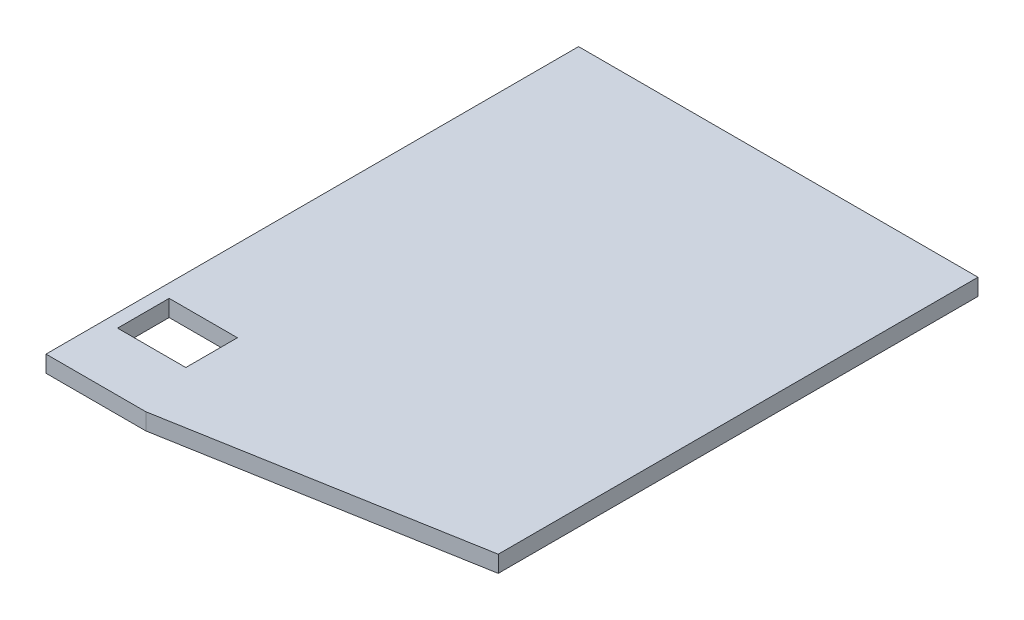
ISO-10303-21;
HEADER;
FILE_DESCRIPTION(('STEP AP214'),'2;1');
FILE_NAME('part.step','',(''),(''),'','','');
FILE_SCHEMA(('AUTOMOTIVE_DESIGN { 1 0 10303 214 1 1 1 1 }'));
ENDSEC;
DATA;
#1=APPLICATION_CONTEXT('core data for automotive mechanical design processes');
#2=APPLICATION_PROTOCOL_DEFINITION('international standard','automotive_design',2000,#1);
#3=PRODUCT_CONTEXT('',#1,'mechanical');
#4=PRODUCT('Part','Part','',(#3));
#5=PRODUCT_RELATED_PRODUCT_CATEGORY('part','',(#4));
#6=PRODUCT_DEFINITION_FORMATION('','',#4);
#7=PRODUCT_DEFINITION_CONTEXT('part definition',#1,'design');
#8=PRODUCT_DEFINITION('design','',#6,#7);
#9=PRODUCT_DEFINITION_SHAPE('','',#8);
#10=(LENGTH_UNIT() NAMED_UNIT(*) SI_UNIT(.MILLI.,.METRE.));
#11=(NAMED_UNIT(*) PLANE_ANGLE_UNIT() SI_UNIT($,.RADIAN.));
#12=(NAMED_UNIT(*) SI_UNIT($,.STERADIAN.) SOLID_ANGLE_UNIT());
#13=UNCERTAINTY_MEASURE_WITH_UNIT(LENGTH_MEASURE(1.E-05),#10,'distance_accuracy_value','');
#14=(GEOMETRIC_REPRESENTATION_CONTEXT(3) GLOBAL_UNCERTAINTY_ASSIGNED_CONTEXT((#13)) GLOBAL_UNIT_ASSIGNED_CONTEXT((#10,
#11,#12)) REPRESENTATION_CONTEXT('',''));
#15=CARTESIAN_POINT('',(0.,0.,0.));
#16=DIRECTION('',(0.,0.,1.));
#17=DIRECTION('',(1.,0.,0.));
#18=AXIS2_PLACEMENT_3D('',#15,#16,#17);
#19=CARTESIAN_POINT('',(0.,0.,33.));
#20=DIRECTION('',(0.,1.,0.));
#21=DIRECTION('',(-1.,0.,0.));
#22=AXIS2_PLACEMENT_3D('',#19,#20,#21);
#23=PLANE('',#22);
#24=DIRECTION('',(1.,0.,0.));
#25=VECTOR('',#24,1.);
#26=CARTESIAN_POINT('',(24.,0.,32.));
#27=LINE('',#26,#25);
#28=CARTESIAN_POINT('',(0.,0.,32.));
#29=VERTEX_POINT('',#28);
#30=CARTESIAN_POINT('',(6.,0.,32.));
#31=VERTEX_POINT('',#30);
#32=EDGE_CURVE('E157',#29,#31,#27,.T.);
#33=ORIENTED_EDGE('',*,*,#32,.F.);
#34=DIRECTION('',(0.,0.,-1.));
#35=VECTOR('',#34,1.);
#36=CARTESIAN_POINT('',(0.,0.,33.));
#37=LINE('',#36,#35);
#38=CARTESIAN_POINT('',(0.,0.,0.));
#39=VERTEX_POINT('',#38);
#40=EDGE_CURVE('E50',#29,#39,#37,.T.);
#41=ORIENTED_EDGE('',*,*,#40,.T.);
#42=DIRECTION('',(1.,0.,0.));
#43=VECTOR('',#42,1.);
#44=CARTESIAN_POINT('',(0.,0.,0.));
#45=LINE('',#44,#43);
#46=CARTESIAN_POINT('',(24.,0.,0.));
#47=VERTEX_POINT('',#46);
#48=EDGE_CURVE('E140',#39,#47,#45,.T.);
#49=ORIENTED_EDGE('',*,*,#48,.T.);
#50=DIRECTION('',(0.,0.,-1.));
#51=VECTOR('',#50,1.);
#52=CARTESIAN_POINT('',(24.,0.,33.));
#53=LINE('',#52,#51);
#54=CARTESIAN_POINT('',(24.,0.,28.8261143472476));
#55=VERTEX_POINT('',#54);
#56=EDGE_CURVE('E11',#55,#47,#53,.T.);
#57=ORIENTED_EDGE('',*,*,#56,.F.);
#58=DIRECTION('',(0.984807753012208,0.,-0.173648177666931));
#59=VECTOR('',#58,1.);
#60=CARTESIAN_POINT('',(6.,0.,32.));
#61=LINE('',#60,#59);
#62=EDGE_CURVE('E173',#31,#55,#61,.T.);
#63=ORIENTED_EDGE('',*,*,#62,.F.);
#64=EDGE_LOOP('',(#33,#41,#49,#57,#63));
#65=FACE_BOUND('',#64,.T.);
#66=DIRECTION('',(0.,0.,1.));
#67=VECTOR('',#66,1.);
#68=CARTESIAN_POINT('',(0.800000000000001,0.,28.5));
#69=LINE('',#68,#67);
#70=CARTESIAN_POINT('',(0.800000000000001,0.,25.4));
#71=VERTEX_POINT('',#70);
#72=CARTESIAN_POINT('',(0.800000000000002,0.,28.5));
#73=VERTEX_POINT('',#72);
#74=EDGE_CURVE('E176',#71,#73,#69,.T.);
#75=ORIENTED_EDGE('',*,*,#74,.T.);
#76=DIRECTION('',(-1.,0.,0.));
#77=VECTOR('',#76,1.);
#78=CARTESIAN_POINT('',(4.9,0.,28.5));
#79=LINE('',#78,#77);
#80=CARTESIAN_POINT('',(4.9,0.,28.5));
#81=VERTEX_POINT('',#80);
#82=EDGE_CURVE('E134',#81,#73,#79,.T.);
#83=ORIENTED_EDGE('',*,*,#82,.F.);
#84=DIRECTION('',(0.,0.,1.));
#85=VECTOR('',#84,1.);
#86=CARTESIAN_POINT('',(4.9,0.,28.5));
#87=LINE('',#86,#85);
#88=CARTESIAN_POINT('',(4.9,0.,25.4));
#89=VERTEX_POINT('',#88);
#90=EDGE_CURVE('E130',#89,#81,#87,.T.);
#91=ORIENTED_EDGE('',*,*,#90,.F.);
#92=DIRECTION('',(-1.,0.,0.));
#93=VECTOR('',#92,1.);
#94=CARTESIAN_POINT('',(4.9,0.,25.4));
#95=LINE('',#94,#93);
#96=EDGE_CURVE('E131',#89,#71,#95,.T.);
#97=ORIENTED_EDGE('',*,*,#96,.T.);
#98=EDGE_LOOP('',(#75,#83,#91,#97));
#99=FACE_BOUND('',#98,.T.);
#100=ADVANCED_FACE('F43',(#65,#99),#23,.F.);
#101=CARTESIAN_POINT('',(24.,0.,33.));
#102=DIRECTION('',(-1.,0.,0.));
#103=DIRECTION('',(0.,0.,1.));
#104=AXIS2_PLACEMENT_3D('',#101,#102,#103);
#105=PLANE('',#104);
#106=DIRECTION('',(0.,1.,0.));
#107=VECTOR('',#106,1.);
#108=CARTESIAN_POINT('',(24.,0.,0.));
#109=LINE('',#108,#107);
#110=CARTESIAN_POINT('',(24.,1.,0.));
#111=VERTEX_POINT('',#110);
#112=EDGE_CURVE('E144',#47,#111,#109,.T.);
#113=ORIENTED_EDGE('',*,*,#112,.T.);
#114=DIRECTION('',(0.,0.,1.));
#115=VECTOR('',#114,1.);
#116=CARTESIAN_POINT('',(24.,1.,0.));
#117=LINE('',#116,#115);
#118=CARTESIAN_POINT('',(24.,1.,28.8261143472476));
#119=VERTEX_POINT('',#118);
#120=EDGE_CURVE('E169',#111,#119,#117,.T.);
#121=ORIENTED_EDGE('',*,*,#120,.T.);
#122=DIRECTION('',(0.,-1.,0.));
#123=VECTOR('',#122,1.);
#124=CARTESIAN_POINT('',(24.,2.50000000000001,28.8261143472476));
#125=LINE('',#124,#123);
#126=EDGE_CURVE('E171',#119,#55,#125,.T.);
#127=ORIENTED_EDGE('',*,*,#126,.T.);
#128=ORIENTED_EDGE('',*,*,#56,.T.);
#129=EDGE_LOOP('',(#113,#121,#127,#128));
#130=FACE_BOUND('',#129,.T.);
#131=ADVANCED_FACE('F168',(#130),#105,.F.);
#132=CARTESIAN_POINT('',(0.,0.,33.));
#133=DIRECTION('',(1.,0.,0.));
#134=DIRECTION('',(0.,0.,-1.));
#135=AXIS2_PLACEMENT_3D('',#132,#133,#134);
#136=PLANE('',#135);
#137=DIRECTION('',(0.,-1.,0.));
#138=VECTOR('',#137,1.);
#139=CARTESIAN_POINT('',(0.,0.,32.));
#140=LINE('',#139,#138);
#141=CARTESIAN_POINT('',(0.,1.,32.));
#142=VERTEX_POINT('',#141);
#143=EDGE_CURVE('E181',#142,#29,#140,.T.);
#144=ORIENTED_EDGE('',*,*,#143,.F.);
#145=DIRECTION('',(0.,0.,-1.));
#146=VECTOR('',#145,1.);
#147=CARTESIAN_POINT('',(0.,1.,32.));
#148=LINE('',#147,#146);
#149=CARTESIAN_POINT('',(0.,1.,0.));
#150=VERTEX_POINT('',#149);
#151=EDGE_CURVE('E195',#142,#150,#148,.T.);
#152=ORIENTED_EDGE('',*,*,#151,.T.);
#153=DIRECTION('',(0.,-1.,0.));
#154=VECTOR('',#153,1.);
#155=CARTESIAN_POINT('',(0.,0.,0.));
#156=LINE('',#155,#154);
#157=EDGE_CURVE('E147',#150,#39,#156,.T.);
#158=ORIENTED_EDGE('',*,*,#157,.T.);
#159=ORIENTED_EDGE('',*,*,#40,.F.);
#160=EDGE_LOOP('',(#144,#152,#158,#159));
#161=FACE_BOUND('',#160,.T.);
#162=ADVANCED_FACE('F212',(#161),#136,.F.);
#163=CARTESIAN_POINT('',(0.,0.,0.));
#164=DIRECTION('',(0.,0.,1.));
#165=DIRECTION('',(1.,0.,0.));
#166=AXIS2_PLACEMENT_3D('',#163,#164,#165);
#167=PLANE('',#166);
#168=ORIENTED_EDGE('',*,*,#157,.F.);
#169=DIRECTION('',(1.,0.,0.));
#170=VECTOR('',#169,1.);
#171=CARTESIAN_POINT('',(0.,1.,0.));
#172=LINE('',#171,#170);
#173=EDGE_CURVE('E165',#150,#111,#172,.T.);
#174=ORIENTED_EDGE('',*,*,#173,.T.);
#175=ORIENTED_EDGE('',*,*,#112,.F.);
#176=ORIENTED_EDGE('',*,*,#48,.F.);
#177=EDGE_LOOP('',(#168,#174,#175,#176));
#178=FACE_BOUND('',#177,.T.);
#179=ADVANCED_FACE('F163',(#178),#167,.F.);
#180=CARTESIAN_POINT('',(4.9,2.5,28.5));
#181=DIRECTION('',(0.,0.,1.));
#182=DIRECTION('',(1.,0.,0.));
#183=AXIS2_PLACEMENT_3D('',#180,#181,#182);
#184=PLANE('',#183);
#185=DIRECTION('',(0.,1.,0.));
#186=VECTOR('',#185,1.);
#187=CARTESIAN_POINT('',(0.800000000000002,-3.20156211871642,28.5));
#188=LINE('',#187,#186);
#189=CARTESIAN_POINT('',(0.800000000000001,1.,28.5));
#190=VERTEX_POINT('',#189);
#191=EDGE_CURVE('E125',#73,#190,#188,.T.);
#192=ORIENTED_EDGE('',*,*,#191,.T.);
#193=DIRECTION('',(-1.,0.,0.));
#194=VECTOR('',#193,1.);
#195=CARTESIAN_POINT('',(4.9,1.,28.5));
#196=LINE('',#195,#194);
#197=CARTESIAN_POINT('',(4.9,1.,28.5));
#198=VERTEX_POINT('',#197);
#199=EDGE_CURVE('E65',#198,#190,#196,.T.);
#200=ORIENTED_EDGE('',*,*,#199,.F.);
#201=DIRECTION('',(0.,1.,0.));
#202=VECTOR('',#201,1.);
#203=CARTESIAN_POINT('',(4.9,2.5,28.5));
#204=LINE('',#203,#202);
#205=EDGE_CURVE('E122',#81,#198,#204,.T.);
#206=ORIENTED_EDGE('',*,*,#205,.F.);
#207=ORIENTED_EDGE('',*,*,#82,.T.);
#208=EDGE_LOOP('',(#192,#200,#206,#207));
#209=FACE_BOUND('',#208,.T.);
#210=ADVANCED_FACE('F121',(#209),#184,.F.);
#211=CARTESIAN_POINT('',(4.9,2.5,25.4));
#212=DIRECTION('',(0.,0.,-1.));
#213=DIRECTION('',(-1.,0.,0.));
#214=AXIS2_PLACEMENT_3D('',#211,#212,#213);
#215=PLANE('',#214);
#216=DIRECTION('',(0.,-1.,0.));
#217=VECTOR('',#216,1.);
#218=CARTESIAN_POINT('',(4.9,2.5,25.4));
#219=LINE('',#218,#217);
#220=CARTESIAN_POINT('',(4.9,1.,25.4));
#221=VERTEX_POINT('',#220);
#222=EDGE_CURVE('E136',#221,#89,#219,.T.);
#223=ORIENTED_EDGE('',*,*,#222,.F.);
#224=DIRECTION('',(1.,0.,0.));
#225=VECTOR('',#224,1.);
#226=CARTESIAN_POINT('',(0.800000000000001,1.,25.4));
#227=LINE('',#226,#225);
#228=CARTESIAN_POINT('',(0.800000000000001,1.,25.4));
#229=VERTEX_POINT('',#228);
#230=EDGE_CURVE('E113',#229,#221,#227,.T.);
#231=ORIENTED_EDGE('',*,*,#230,.F.);
#232=DIRECTION('',(0.,1.,0.));
#233=VECTOR('',#232,1.);
#234=CARTESIAN_POINT('',(0.800000000000002,-3.20156211871642,25.4));
#235=LINE('',#234,#233);
#236=EDGE_CURVE('E188',#71,#229,#235,.T.);
#237=ORIENTED_EDGE('',*,*,#236,.F.);
#238=ORIENTED_EDGE('',*,*,#96,.F.);
#239=EDGE_LOOP('',(#223,#231,#237,#238));
#240=FACE_BOUND('',#239,.T.);
#241=ADVANCED_FACE('F205',(#240),#215,.F.);
#242=CARTESIAN_POINT('',(4.9,0.,0.));
#243=DIRECTION('',(-1.,0.,0.));
#244=DIRECTION('',(0.,0.,1.));
#245=AXIS2_PLACEMENT_3D('',#242,#243,#244);
#246=PLANE('',#245);
#247=DIRECTION('',(0.,0.,1.));
#248=VECTOR('',#247,1.);
#249=CARTESIAN_POINT('',(4.9,1.,25.4));
#250=LINE('',#249,#248);
#251=EDGE_CURVE('E110',#221,#198,#250,.T.);
#252=ORIENTED_EDGE('',*,*,#251,.F.);
#253=ORIENTED_EDGE('',*,*,#222,.T.);
#254=ORIENTED_EDGE('',*,*,#90,.T.);
#255=ORIENTED_EDGE('',*,*,#205,.T.);
#256=EDGE_LOOP('',(#252,#253,#254,#255));
#257=FACE_BOUND('',#256,.T.);
#258=ADVANCED_FACE('F128',(#257),#246,.T.);
#259=CARTESIAN_POINT('',(0.,0.,32.));
#260=DIRECTION('',(0.,0.,1.));
#261=DIRECTION('',(1.,0.,0.));
#262=AXIS2_PLACEMENT_3D('',#259,#260,#261);
#263=PLANE('',#262);
#264=DIRECTION('',(-1.,0.,0.));
#265=VECTOR('',#264,1.);
#266=CARTESIAN_POINT('',(6.,1.,32.));
#267=LINE('',#266,#265);
#268=CARTESIAN_POINT('',(6.,1.,32.));
#269=VERTEX_POINT('',#268);
#270=EDGE_CURVE('E57',#269,#142,#267,.T.);
#271=ORIENTED_EDGE('',*,*,#270,.T.);
#272=ORIENTED_EDGE('',*,*,#143,.T.);
#273=ORIENTED_EDGE('',*,*,#32,.T.);
#274=DIRECTION('',(0.,-1.,0.));
#275=VECTOR('',#274,1.);
#276=CARTESIAN_POINT('',(6.,2.50000000000001,32.));
#277=LINE('',#276,#275);
#278=EDGE_CURVE('E175',#269,#31,#277,.T.);
#279=ORIENTED_EDGE('',*,*,#278,.F.);
#280=EDGE_LOOP('',(#271,#272,#273,#279));
#281=FACE_BOUND('',#280,.T.);
#282=ADVANCED_FACE('F180',(#281),#263,.T.);
#283=CARTESIAN_POINT('',(6.,2.50000000000001,32.));
#284=DIRECTION('',(-0.173648177666931,0.,-0.984807753012208));
#285=DIRECTION('',(-0.984807753012208,0.,0.173648177666931));
#286=AXIS2_PLACEMENT_3D('',#283,#284,#285);
#287=PLANE('',#286);
#288=ORIENTED_EDGE('',*,*,#126,.F.);
#289=DIRECTION('',(-0.984807753012208,0.,0.173648177666931));
#290=VECTOR('',#289,1.);
#291=CARTESIAN_POINT('',(24.,1.,28.8261143472476));
#292=LINE('',#291,#290);
#293=EDGE_CURVE('E199',#119,#269,#292,.T.);
#294=ORIENTED_EDGE('',*,*,#293,.T.);
#295=ORIENTED_EDGE('',*,*,#278,.T.);
#296=ORIENTED_EDGE('',*,*,#62,.T.);
#297=EDGE_LOOP('',(#288,#294,#295,#296));
#298=FACE_BOUND('',#297,.T.);
#299=ADVANCED_FACE('F228',(#298),#287,.F.);
#300=CARTESIAN_POINT('',(0.800000000000002,-3.20156211871642,28.5));
#301=DIRECTION('',(1.,0.,0.));
#302=DIRECTION('',(0.,1.,0.));
#303=AXIS2_PLACEMENT_3D('',#300,#301,#302);
#304=PLANE('',#303);
#305=DIRECTION('',(0.,0.,-1.));
#306=VECTOR('',#305,1.);
#307=CARTESIAN_POINT('',(0.800000000000002,1.,28.5));
#308=LINE('',#307,#306);
#309=EDGE_CURVE('E126',#190,#229,#308,.T.);
#310=ORIENTED_EDGE('',*,*,#309,.F.);
#311=ORIENTED_EDGE('',*,*,#191,.F.);
#312=ORIENTED_EDGE('',*,*,#74,.F.);
#313=ORIENTED_EDGE('',*,*,#236,.T.);
#314=EDGE_LOOP('',(#310,#311,#312,#313));
#315=FACE_BOUND('',#314,.T.);
#316=ADVANCED_FACE('F207',(#315),#304,.T.);
#317=CARTESIAN_POINT('',(0.,1.,0.));
#318=DIRECTION('',(0.,-1.,0.));
#319=DIRECTION('',(1.,0.,0.));
#320=AXIS2_PLACEMENT_3D('',#317,#318,#319);
#321=PLANE('',#320);
#322=ORIENTED_EDGE('',*,*,#230,.T.);
#323=ORIENTED_EDGE('',*,*,#251,.T.);
#324=ORIENTED_EDGE('',*,*,#199,.T.);
#325=ORIENTED_EDGE('',*,*,#309,.T.);
#326=EDGE_LOOP('',(#322,#323,#324,#325));
#327=FACE_BOUND('',#326,.T.);
#328=ORIENTED_EDGE('',*,*,#293,.F.);
#329=ORIENTED_EDGE('',*,*,#120,.F.);
#330=ORIENTED_EDGE('',*,*,#173,.F.);
#331=ORIENTED_EDGE('',*,*,#151,.F.);
#332=ORIENTED_EDGE('',*,*,#270,.F.);
#333=EDGE_LOOP('',(#328,#329,#330,#331,#332));
#334=FACE_BOUND('',#333,.T.);
#335=ADVANCED_FACE('F111',(#327,#334),#321,.F.);
#336=CLOSED_SHELL('',(#100,#131,#162,#179,#210,#241,#258,#282,#299,#316,#335));
#337=MANIFOLD_SOLID_BREP('B2',#336);
#338=ADVANCED_BREP_SHAPE_REPRESENTATION('',(#18,#337),#14);
#339=SHAPE_DEFINITION_REPRESENTATION(#9,#338);
ENDSEC;
END-ISO-10303-21;
